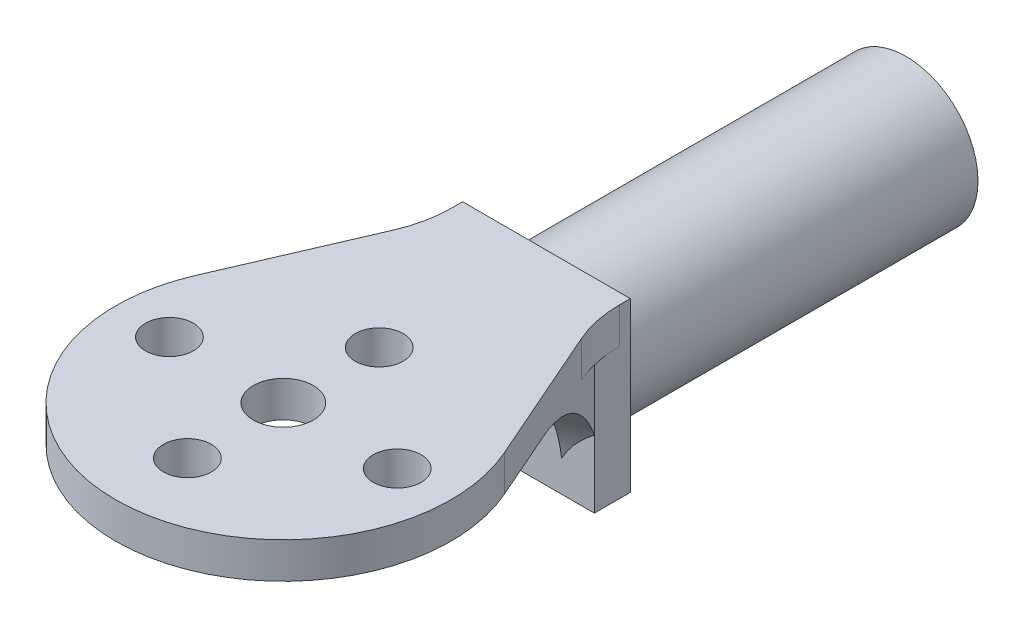
ISO-10303-21;
HEADER;
FILE_DESCRIPTION(('STEP AP214'),'2;1');
FILE_NAME('part.step','',(''),(''),'','','');
FILE_SCHEMA(('AUTOMOTIVE_DESIGN { 1 0 10303 214 1 1 1 1 }'));
ENDSEC;
DATA;
#1=APPLICATION_CONTEXT('core data for automotive mechanical design processes');
#2=APPLICATION_PROTOCOL_DEFINITION('international standard','automotive_design',2000,#1);
#3=PRODUCT_CONTEXT('',#1,'mechanical');
#4=PRODUCT('Part','Part','',(#3));
#5=PRODUCT_RELATED_PRODUCT_CATEGORY('part','',(#4));
#6=PRODUCT_DEFINITION_FORMATION('','',#4);
#7=PRODUCT_DEFINITION_CONTEXT('part definition',#1,'design');
#8=PRODUCT_DEFINITION('design','',#6,#7);
#9=PRODUCT_DEFINITION_SHAPE('','',#8);
#10=(LENGTH_UNIT() NAMED_UNIT(*) SI_UNIT(.MILLI.,.METRE.));
#11=(NAMED_UNIT(*) PLANE_ANGLE_UNIT() SI_UNIT($,.RADIAN.));
#12=(NAMED_UNIT(*) SI_UNIT($,.STERADIAN.) SOLID_ANGLE_UNIT());
#13=UNCERTAINTY_MEASURE_WITH_UNIT(LENGTH_MEASURE(1.E-05),#10,'distance_accuracy_value','');
#14=(GEOMETRIC_REPRESENTATION_CONTEXT(3) GLOBAL_UNCERTAINTY_ASSIGNED_CONTEXT((#13)) GLOBAL_UNIT_ASSIGNED_CONTEXT((#10,
#11,#12)) REPRESENTATION_CONTEXT('',''));
#15=CARTESIAN_POINT('',(0.,0.,0.));
#16=DIRECTION('',(0.,0.,1.));
#17=DIRECTION('',(1.,0.,0.));
#18=AXIS2_PLACEMENT_3D('',#15,#16,#17);
#19=CARTESIAN_POINT('',(0.,4.,0.));
#20=DIRECTION('',(0.,1.,0.));
#21=DIRECTION('',(0.,0.,1.));
#22=AXIS2_PLACEMENT_3D('',#19,#20,#21);
#23=PLANE('',#22);
#24=CARTESIAN_POINT('',(9.55185827927666,4.,51.9999292293122));
#25=DIRECTION('',(0.,1.,0.));
#26=DIRECTION('',(0.,0.,1.));
#27=AXIS2_PLACEMENT_3D('',#24,#25,#26);
#28=CIRCLE('',#27,2.);
#29=CARTESIAN_POINT('',(9.55185827927666,4.,53.9999292293122));
#30=VERTEX_POINT('',#29);
#31=EDGE_CURVE('E303',#30,#30,#28,.T.);
#32=ORIENTED_EDGE('',*,*,#31,.T.);
#33=EDGE_LOOP('',(#32));
#34=FACE_BOUND('',#33,.T.);
#35=CARTESIAN_POINT('',(0.0518582792766051,4.,59.9999292293122));
#36=DIRECTION('',(0.,1.,0.));
#37=DIRECTION('',(0.,0.,1.));
#38=AXIS2_PLACEMENT_3D('',#35,#36,#37);
#39=CIRCLE('',#38,2.);
#40=CARTESIAN_POINT('',(0.0518582792766051,4.,61.9999292293122));
#41=VERTEX_POINT('',#40);
#42=EDGE_CURVE('E300',#41,#41,#39,.T.);
#43=ORIENTED_EDGE('',*,*,#42,.T.);
#44=EDGE_LOOP('',(#43));
#45=FACE_BOUND('',#44,.T.);
#46=CARTESIAN_POINT('',(-9.44814172072447,4.,51.9999292293122));
#47=DIRECTION('',(0.,1.,0.));
#48=DIRECTION('',(0.,0.,1.));
#49=AXIS2_PLACEMENT_3D('',#46,#47,#48);
#50=CIRCLE('',#49,2.);
#51=CARTESIAN_POINT('',(-9.44814172072447,4.,53.9999292293122));
#52=VERTEX_POINT('',#51);
#53=EDGE_CURVE('E297',#52,#52,#50,.T.);
#54=ORIENTED_EDGE('',*,*,#53,.T.);
#55=EDGE_LOOP('',(#54));
#56=FACE_BOUND('',#55,.T.);
#57=CARTESIAN_POINT('',(0.051858279275528,4.,43.9999292293122));
#58=DIRECTION('',(0.,1.,0.));
#59=DIRECTION('',(0.,0.,1.));
#60=AXIS2_PLACEMENT_3D('',#57,#58,#59);
#61=CIRCLE('',#60,2.);
#62=CARTESIAN_POINT('',(0.051858279275528,4.,45.9999292293122));
#63=VERTEX_POINT('',#62);
#64=EDGE_CURVE('E294',#63,#63,#61,.T.);
#65=ORIENTED_EDGE('',*,*,#64,.T.);
#66=EDGE_LOOP('',(#65));
#67=FACE_BOUND('',#66,.T.);
#68=CARTESIAN_POINT('',(0.051858279275528,4.,51.9999292293122));
#69=DIRECTION('',(0.,1.,0.));
#70=DIRECTION('',(0.,0.,1.));
#71=AXIS2_PLACEMENT_3D('',#68,#69,#70);
#72=CIRCLE('',#71,2.5);
#73=CARTESIAN_POINT('',(0.051858279275528,4.,54.4999292293122));
#74=VERTEX_POINT('',#73);
#75=EDGE_CURVE('E252',#74,#74,#72,.T.);
#76=ORIENTED_EDGE('',*,*,#75,.T.);
#77=EDGE_LOOP('',(#76));
#78=FACE_BOUND('',#77,.T.);
#79=DIRECTION('',(0.402002149140903,0.,0.915638723561916));
#80=VECTOR('',#79,1.);
#81=CARTESIAN_POINT('',(4.15877008903242,4.,32.7474139647231));
#82=LINE('',#81,#80);
#83=CARTESIAN_POINT('',(4.26966549615247,4.,33.));
#84=VERTEX_POINT('',#83);
#85=CARTESIAN_POINT('',(8.0681097778568,4.,41.6517016912807));
#86=VERTEX_POINT('',#85);
#87=EDGE_CURVE('E54',#84,#86,#82,.T.);
#88=ORIENTED_EDGE('',*,*,#87,.T.);
#89=DIRECTION('',(0.915638723561916,0.,-0.402002149140903));
#90=VECTOR('',#89,1.);
#91=CARTESIAN_POINT('',(8.0681097778568,4.,41.6517016912807));
#92=LINE('',#91,#90);
#93=CARTESIAN_POINT('',(10.3572065867616,4.,40.6466963184284));
#94=VERTEX_POINT('',#93);
#95=EDGE_CURVE('E161',#86,#94,#92,.T.);
#96=ORIENTED_EDGE('',*,*,#95,.T.);
#97=DIRECTION('',(0.402002149140903,0.,0.915638723561916));
#98=VECTOR('',#97,1.);
#99=CARTESIAN_POINT('',(-6.27816834077861,4.,2.7563678781992));
#100=LINE('',#99,#98);
#101=CARTESIAN_POINT('',(12.8708004091423,4.,46.3718991413395));
#102=VERTEX_POINT('',#101);
#103=EDGE_CURVE('E149',#94,#102,#100,.T.);
#104=ORIENTED_EDGE('',*,*,#103,.T.);
#105=CARTESIAN_POINT('',(0.051858279275528,4.,51.9999292293122));
#106=DIRECTION('',(0.,1.,0.));
#107=DIRECTION('',(0.,0.,1.));
#108=AXIS2_PLACEMENT_3D('',#105,#106,#107);
#109=CIRCLE('',#108,14.);
#110=CARTESIAN_POINT('',(-12.8034008359654,4.,46.4553541256622));
#111=VERTEX_POINT('',#110);
#112=EDGE_CURVE('E159',#111,#102,#109,.T.);
#113=ORIENTED_EDGE('',*,*,#112,.F.);
#114=DIRECTION('',(-0.396041078832143,0.,0.91823279394578));
#115=VECTOR('',#114,1.);
#116=CARTESIAN_POINT('',(6.09865066185789,4.,2.63039634771003));
#117=LINE('',#116,#115);
#118=CARTESIAN_POINT('',(-10.3105364482538,4.,40.6755753249218));
#119=VERTEX_POINT('',#118);
#120=EDGE_CURVE('E316',#119,#111,#117,.T.);
#121=ORIENTED_EDGE('',*,*,#120,.F.);
#122=DIRECTION('',(-0.91823279394578,0.,-0.396041078832143));
#123=VECTOR('',#122,1.);
#124=CARTESIAN_POINT('',(-8.01495446338935,4.,41.6656780220022));
#125=LINE('',#124,#123);
#126=CARTESIAN_POINT('',(-8.01495446338935,4.,41.6656780220022));
#127=VERTEX_POINT('',#126);
#128=EDGE_CURVE('E343',#127,#119,#125,.T.);
#129=ORIENTED_EDGE('',*,*,#128,.F.);
#130=DIRECTION('',(0.396041078832143,0.,-0.91823279394578));
#131=VECTOR('',#130,1.);
#132=CARTESIAN_POINT('',(-4.15893115563554,4.,32.7253755012641));
#133=LINE('',#132,#131);
#134=CARTESIAN_POINT('',(-4.27737887768401,4.,33.));
#135=VERTEX_POINT('',#134);
#136=EDGE_CURVE('E340',#127,#135,#133,.T.);
#137=ORIENTED_EDGE('',*,*,#136,.T.);
#138=DIRECTION('',(1.,0.,0.));
#139=VECTOR('',#138,1.);
#140=CARTESIAN_POINT('',(0.,4.,33.));
#141=LINE('',#140,#139);
#142=EDGE_CURVE('E308',#135,#84,#141,.T.);
#143=ORIENTED_EDGE('',*,*,#142,.T.);
#144=EDGE_LOOP('',(#88,#96,#104,#113,#121,#129,#137,#143));
#145=FACE_BOUND('',#144,.T.);
#146=ADVANCED_FACE('F39',(#34,#45,#56,#67,#78,#145),#23,.F.);
#147=CARTESIAN_POINT('',(17.,4.,30.9014720041082));
#148=DIRECTION('',(0.,1.,0.));
#149=DIRECTION('',(0.,0.,1.));
#150=AXIS2_PLACEMENT_3D('',#147,#148,#149);
#151=CIRCLE('',#150,10.);
#152=CARTESIAN_POINT('',(7.84361276438084,4.,34.9214934955173));
#153=VERTEX_POINT('',#152);
#154=CARTESIAN_POINT('',(7.,4.,30.9014720041082));
#155=VERTEX_POINT('',#154);
#156=EDGE_CURVE('E158',#153,#155,#151,.F.);
#157=ORIENTED_EDGE('',*,*,#156,.F.);
#158=DIRECTION('',(0.402002149140903,0.,0.915638723561916));
#159=VECTOR('',#158,1.);
#160=CARTESIAN_POINT('',(6.44786689793721,4.,31.7424085918709));
#161=LINE('',#160,#159);
#162=CARTESIAN_POINT('',(7.,4.,33.));
#163=VERTEX_POINT('',#162);
#164=EDGE_CURVE('E167',#163,#153,#161,.T.);
#165=ORIENTED_EDGE('',*,*,#164,.F.);
#166=DIRECTION('',(0.,0.,-1.));
#167=VECTOR('',#166,1.);
#168=CARTESIAN_POINT('',(7.,4.,0.));
#169=LINE('',#168,#167);
#170=EDGE_CURVE('E310',#163,#155,#169,.T.);
#171=ORIENTED_EDGE('',*,*,#170,.T.);
#172=EDGE_LOOP('',(#157,#165,#171));
#173=FACE_BOUND('',#172,.T.);
#174=ADVANCED_FACE('F334',(#173),#23,.F.);
#175=DIRECTION('',(0.396041078832143,0.,-0.91823279394578));
#176=VECTOR('',#175,1.);
#177=CARTESIAN_POINT('',(6.09865066185789,4.,2.63039634771004));
#178=LINE('',#177,#176);
#179=CARTESIAN_POINT('',(-7.81767206054221,4.,34.8957965241815));
#180=VERTEX_POINT('',#179);
#181=CARTESIAN_POINT('',(-7.,4.,33.));
#182=VERTEX_POINT('',#181);
#183=EDGE_CURVE('E11',#180,#182,#178,.T.);
#184=ORIENTED_EDGE('',*,*,#183,.F.);
#185=CARTESIAN_POINT('',(-17.,4.,30.9353857358601));
#186=DIRECTION('',(0.,1.,0.));
#187=DIRECTION('',(0.,0.,1.));
#188=AXIS2_PLACEMENT_3D('',#185,#186,#187);
#189=CIRCLE('',#188,10.);
#190=CARTESIAN_POINT('',(-7.,4.,30.9353857358601));
#191=VERTEX_POINT('',#190);
#192=EDGE_CURVE('E264',#180,#191,#189,.T.);
#193=ORIENTED_EDGE('',*,*,#192,.T.);
#194=DIRECTION('',(0.,0.,1.));
#195=VECTOR('',#194,1.);
#196=CARTESIAN_POINT('',(-7.,4.,0.));
#197=LINE('',#196,#195);
#198=EDGE_CURVE('E306',#191,#182,#197,.T.);
#199=ORIENTED_EDGE('',*,*,#198,.T.);
#200=EDGE_LOOP('',(#184,#193,#199));
#201=FACE_BOUND('',#200,.T.);
#202=ADVANCED_FACE('F392',(#201),#23,.F.);
#203=CARTESIAN_POINT('',(0.,0.,33.));
#204=DIRECTION('',(0.,0.,1.));
#205=DIRECTION('',(1.,0.,0.));
#206=AXIS2_PLACEMENT_3D('',#203,#204,#205);
#207=PLANE('',#206);
#208=CARTESIAN_POINT('',(0.,0.,33.));
#209=DIRECTION('',(0.,0.,1.));
#210=DIRECTION('',(1.,0.,0.));
#211=AXIS2_PLACEMENT_3D('',#208,#209,#210);
#212=CIRCLE('',#211,2.5);
#213=CARTESIAN_POINT('',(2.5,0.,33.));
#214=VERTEX_POINT('',#213);
#215=EDGE_CURVE('E168',#214,#214,#212,.T.);
#216=ORIENTED_EDGE('',*,*,#215,.F.);
#217=EDGE_LOOP('',(#216));
#218=FACE_BOUND('',#217,.T.);
#219=CARTESIAN_POINT('',(4.26966549615247,-4.39857791230481,33.));
#220=CARTESIAN_POINT('',(4.35557810708206,-4.23809018643889,33.));
#221=CARTESIAN_POINT('',(4.44796712719578,-4.08119908312746,33.));
#222=CARTESIAN_POINT('',(4.64374575712088,-3.77511158173039,33.));
#223=CARTESIAN_POINT('',(4.74709990752518,-3.62589256530896,33.));
#224=CARTESIAN_POINT('',(4.96334532686161,-3.33473886176205,33.));
#225=CARTESIAN_POINT('',(5.0762302377719,-3.19279941842389,33.));
#226=CARTESIAN_POINT('',(5.30852706258606,-2.91791083639027,33.));
#227=CARTESIAN_POINT('',(5.42782027662737,-2.78486101999803,33.));
#228=CARTESIAN_POINT('',(5.67334191683889,-2.5251968358304,33.));
#229=CARTESIAN_POINT('',(5.79957443956189,-2.39858635622287,33.));
#230=CARTESIAN_POINT('',(6.05793455654453,-2.15159589990567,33.));
#231=CARTESIAN_POINT('',(6.19006104302503,-2.03121476149288,33.));
#232=CARTESIAN_POINT('',(6.43392525099127,-1.81856756395461,33.));
#233=CARTESIAN_POINT('',(6.54478806669445,-1.72529300727227,33.));
#234=CARTESIAN_POINT('',(6.76997960807686,-1.54206031754586,33.));
#235=CARTESIAN_POINT('',(6.88432066799888,-1.45211733002247,33.));
#236=CARTESIAN_POINT('',(6.99999999999999,-1.36394541030519,33.));
#237=B_SPLINE_CURVE_WITH_KNOTS('',3,(#219,#220,#221,#222,#223,#224,#225,#226,#227,#228,#229,
#230,#231,#232,#233,#234,#235,#236),.UNSPECIFIED.,.F.,.F.,(4,2,2,2,2,2,2,2,4),(0.,
0.545793393495718,1.08987268295838,1.63359183945271,2.16940908543465,2.70554611557918,
3.2415827990898,3.67615110769117,4.11249904194571),.UNSPECIFIED.);
#238=CARTESIAN_POINT('',(4.26966549615247,-4.39857791230481,33.));
#239=VERTEX_POINT('',#238);
#240=CARTESIAN_POINT('',(7.,-1.36394541030517,33.));
#241=VERTEX_POINT('',#240);
#242=EDGE_CURVE('E62',#239,#241,#237,.T.);
#243=ORIENTED_EDGE('',*,*,#242,.F.);
#244=DIRECTION('',(0.,1.,0.));
#245=VECTOR('',#244,1.);
#246=CARTESIAN_POINT('',(4.26966549615247,0.,33.));
#247=LINE('',#246,#245);
#248=EDGE_CURVE('E186',#239,#84,#247,.T.);
#249=ORIENTED_EDGE('',*,*,#248,.T.);
#250=ORIENTED_EDGE('',*,*,#142,.F.);
#251=DIRECTION('',(0.,1.,0.));
#252=VECTOR('',#251,1.);
#253=CARTESIAN_POINT('',(-4.27737887768402,0.,33.));
#254=LINE('',#253,#252);
#255=CARTESIAN_POINT('',(-4.27737887768402,-4.29454560285519,33.));
#256=VERTEX_POINT('',#255);
#257=EDGE_CURVE('E326',#256,#135,#254,.T.);
#258=ORIENTED_EDGE('',*,*,#257,.F.);
#259=CARTESIAN_POINT('',(-7.0000000000001,-1.3597215527771,33.0000000000002));
#260=CARTESIAN_POINT('',(-6.85226719892343,-1.47041960169081,33.0000000000001));
#261=CARTESIAN_POINT('',(-6.70660973909124,-1.58394492958086,33.));
#262=CARTESIAN_POINT('',(-6.41966411909858,-1.81746173609029,33.));
#263=CARTESIAN_POINT('',(-6.27839455296337,-1.93747603144562,33.));
#264=CARTESIAN_POINT('',(-6.00138746788396,-2.18411529013319,33.));
#265=CARTESIAN_POINT('',(-5.86565755912559,-2.31074883620528,33.));
#266=CARTESIAN_POINT('',(-5.6035474056518,-2.56825728241939,33.));
#267=CARTESIAN_POINT('',(-5.47703444348814,-2.6989966637613,33.));
#268=CARTESIAN_POINT('',(-5.23167618190011,-2.96721544555661,33.));
#269=CARTESIAN_POINT('',(-5.11282179763055,-3.10468650664694,33.));
#270=CARTESIAN_POINT('',(-4.88401135045867,-3.38664640135503,33.));
#271=CARTESIAN_POINT('',(-4.77404591202944,-3.53112757668643,33.0000000000001));
#272=CARTESIAN_POINT('',(-4.59911148070718,-3.77830834628809,33.0000000000001));
#273=CARTESIAN_POINT('',(-4.53130060112186,-3.87900036717615,33.));
#274=CARTESIAN_POINT('',(-4.40049466690124,-4.08408709213776,33.));
#275=CARTESIAN_POINT('',(-4.33752218623202,-4.18849617581251,32.9999999999999));
#276=CARTESIAN_POINT('',(-4.27737887768402,-4.29454560285519,33.));
#277=B_SPLINE_CURVE_WITH_KNOTS('',3,(#259,#260,#261,#262,#263,#264,#265,#266,#267,#268,#269,
#270,#271,#272,#273,#274,#275,#276),.UNSPECIFIED.,.F.,.F.,(4,2,2,2,2,2,2,2,4),(0.,
0.553833381326058,1.10975993497846,1.66642612231681,2.21195669516203,2.75682775396257,
3.30111640589065,3.66516698386851,4.03082419389452),.UNSPECIFIED.);
#278=CARTESIAN_POINT('',(-7.,-1.3597215527781,33.));
#279=VERTEX_POINT('',#278);
#280=EDGE_CURVE('E291',#279,#256,#277,.T.);
#281=ORIENTED_EDGE('',*,*,#280,.F.);
#282=DIRECTION('',(0.,-1.,0.));
#283=VECTOR('',#282,1.);
#284=CARTESIAN_POINT('',(-7.,7.,33.));
#285=LINE('',#284,#283);
#286=CARTESIAN_POINT('',(-7.,-7.,33.));
#287=VERTEX_POINT('',#286);
#288=EDGE_CURVE('E232',#279,#287,#285,.T.);
#289=ORIENTED_EDGE('',*,*,#288,.T.);
#290=DIRECTION('',(1.,0.,0.));
#291=VECTOR('',#290,1.);
#292=CARTESIAN_POINT('',(-7.,-7.,33.));
#293=LINE('',#292,#291);
#294=CARTESIAN_POINT('',(7.,-7.,33.));
#295=VERTEX_POINT('',#294);
#296=EDGE_CURVE('E244',#287,#295,#293,.T.);
#297=ORIENTED_EDGE('',*,*,#296,.T.);
#298=DIRECTION('',(0.,1.,0.));
#299=VECTOR('',#298,1.);
#300=CARTESIAN_POINT('',(7.,7.,33.));
#301=LINE('',#300,#299);
#302=EDGE_CURVE('E228',#295,#241,#301,.T.);
#303=ORIENTED_EDGE('',*,*,#302,.T.);
#304=EDGE_LOOP('',(#243,#249,#250,#258,#281,#289,#297,#303));
#305=FACE_BOUND('',#304,.T.);
#306=ADVANCED_FACE('F188',(#218,#305),#207,.T.);
#307=CARTESIAN_POINT('',(0.,0.,30.));
#308=DIRECTION('',(0.,0.,-1.));
#309=DIRECTION('',(-1.,0.,0.));
#310=AXIS2_PLACEMENT_3D('',#307,#308,#309);
#311=CYLINDRICAL_SURFACE('',#310,6.);
#312=CARTESIAN_POINT('',(0.,0.,30.));
#313=DIRECTION('',(0.,0.,1.));
#314=DIRECTION('',(1.,0.,0.));
#315=AXIS2_PLACEMENT_3D('',#312,#313,#314);
#316=CIRCLE('',#315,6.);
#317=CARTESIAN_POINT('',(6.,0.,30.));
#318=VERTEX_POINT('',#317);
#319=EDGE_CURVE('E47',#318,#318,#316,.T.);
#320=ORIENTED_EDGE('',*,*,#319,.F.);
#321=EDGE_LOOP('',(#320));
#322=FACE_BOUND('',#321,.T.);
#323=CARTESIAN_POINT('',(0.,0.,0.));
#324=DIRECTION('',(0.,0.,1.));
#325=DIRECTION('',(1.,0.,0.));
#326=AXIS2_PLACEMENT_3D('',#323,#324,#325);
#327=CIRCLE('',#326,6.);
#328=CARTESIAN_POINT('',(6.,0.,0.));
#329=VERTEX_POINT('',#328);
#330=EDGE_CURVE('E213',#329,#329,#327,.T.);
#331=ORIENTED_EDGE('',*,*,#330,.T.);
#332=EDGE_LOOP('',(#331));
#333=FACE_BOUND('',#332,.T.);
#334=ADVANCED_FACE('F41',(#322,#333),#311,.T.);
#335=CARTESIAN_POINT('',(0.,0.,0.));
#336=DIRECTION('',(0.,0.,1.));
#337=DIRECTION('',(1.,0.,0.));
#338=AXIS2_PLACEMENT_3D('',#335,#336,#337);
#339=PLANE('',#338);
#340=CARTESIAN_POINT('',(0.,0.,0.));
#341=DIRECTION('',(0.,0.,-1.));
#342=DIRECTION('',(-1.,0.,0.));
#343=AXIS2_PLACEMENT_3D('',#340,#341,#342);
#344=CIRCLE('',#343,2.5);
#345=CARTESIAN_POINT('',(-2.5,0.,0.));
#346=VERTEX_POINT('',#345);
#347=EDGE_CURVE('E174',#346,#346,#344,.T.);
#348=ORIENTED_EDGE('',*,*,#347,.F.);
#349=EDGE_LOOP('',(#348));
#350=FACE_BOUND('',#349,.T.);
#351=ORIENTED_EDGE('',*,*,#330,.F.);
#352=EDGE_LOOP('',(#351));
#353=FACE_BOUND('',#352,.T.);
#354=ADVANCED_FACE('F207',(#350,#353),#339,.F.);
#355=CARTESIAN_POINT('',(-7.,7.,33.));
#356=DIRECTION('',(1.,0.,0.));
#357=DIRECTION('',(0.,0.,-1.));
#358=AXIS2_PLACEMENT_3D('',#355,#356,#357);
#359=PLANE('',#358);
#360=ORIENTED_EDGE('',*,*,#198,.F.);
#361=DIRECTION('',(0.,1.,0.));
#362=VECTOR('',#361,1.);
#363=CARTESIAN_POINT('',(-7.,4.,30.9353857358601));
#364=LINE('',#363,#362);
#365=CARTESIAN_POINT('',(-7.,7.,30.9353857358601));
#366=VERTEX_POINT('',#365);
#367=EDGE_CURVE('E241',#191,#366,#364,.T.);
#368=ORIENTED_EDGE('',*,*,#367,.T.);
#369=DIRECTION('',(0.,0.,-1.));
#370=VECTOR('',#369,1.);
#371=CARTESIAN_POINT('',(-7.,7.,33.));
#372=LINE('',#371,#370);
#373=CARTESIAN_POINT('',(-7.,7.,30.));
#374=VERTEX_POINT('',#373);
#375=EDGE_CURVE('E226',#366,#374,#372,.T.);
#376=ORIENTED_EDGE('',*,*,#375,.T.);
#377=DIRECTION('',(0.,-1.,0.));
#378=VECTOR('',#377,1.);
#379=CARTESIAN_POINT('',(-7.,7.,30.));
#380=LINE('',#379,#378);
#381=CARTESIAN_POINT('',(-7.,-7.,30.));
#382=VERTEX_POINT('',#381);
#383=EDGE_CURVE('E238',#374,#382,#380,.T.);
#384=ORIENTED_EDGE('',*,*,#383,.T.);
#385=DIRECTION('',(0.,0.,-1.));
#386=VECTOR('',#385,1.);
#387=CARTESIAN_POINT('',(-7.,-7.,33.));
#388=LINE('',#387,#386);
#389=EDGE_CURVE('E215',#287,#382,#388,.T.);
#390=ORIENTED_EDGE('',*,*,#389,.F.);
#391=ORIENTED_EDGE('',*,*,#288,.F.);
#392=EDGE_CURVE('E246',#182,#279,#285,.T.);
#393=ORIENTED_EDGE('',*,*,#392,.F.);
#394=EDGE_LOOP('',(#360,#368,#376,#384,#390,#391,#393));
#395=FACE_BOUND('',#394,.T.);
#396=ADVANCED_FACE('F210',(#395),#359,.F.);
#397=CARTESIAN_POINT('',(-7.,-7.,33.));
#398=DIRECTION('',(0.,1.,0.));
#399=DIRECTION('',(0.,0.,1.));
#400=AXIS2_PLACEMENT_3D('',#397,#398,#399);
#401=PLANE('',#400);
#402=DIRECTION('',(1.,0.,0.));
#403=VECTOR('',#402,1.);
#404=CARTESIAN_POINT('',(-7.,-7.,30.));
#405=LINE('',#404,#403);
#406=CARTESIAN_POINT('',(7.,-7.,30.));
#407=VERTEX_POINT('',#406);
#408=EDGE_CURVE('E236',#382,#407,#405,.T.);
#409=ORIENTED_EDGE('',*,*,#408,.T.);
#410=DIRECTION('',(0.,0.,-1.));
#411=VECTOR('',#410,1.);
#412=CARTESIAN_POINT('',(7.,-7.,33.));
#413=LINE('',#412,#411);
#414=EDGE_CURVE('E219',#295,#407,#413,.T.);
#415=ORIENTED_EDGE('',*,*,#414,.F.);
#416=ORIENTED_EDGE('',*,*,#296,.F.);
#417=ORIENTED_EDGE('',*,*,#389,.T.);
#418=EDGE_LOOP('',(#409,#415,#416,#417));
#419=FACE_BOUND('',#418,.T.);
#420=ADVANCED_FACE('F364',(#419),#401,.F.);
#421=CARTESIAN_POINT('',(7.,7.,33.));
#422=DIRECTION('',(-1.,0.,0.));
#423=DIRECTION('',(0.,-1.,0.));
#424=AXIS2_PLACEMENT_3D('',#421,#422,#423);
#425=PLANE('',#424);
#426=DIRECTION('',(0.,0.,-1.));
#427=VECTOR('',#426,1.);
#428=CARTESIAN_POINT('',(7.,7.,33.));
#429=LINE('',#428,#427);
#430=CARTESIAN_POINT('',(7.,7.,30.9014720041082));
#431=VERTEX_POINT('',#430);
#432=CARTESIAN_POINT('',(7.,7.,30.));
#433=VERTEX_POINT('',#432);
#434=EDGE_CURVE('E224',#431,#433,#429,.T.);
#435=ORIENTED_EDGE('',*,*,#434,.F.);
#436=DIRECTION('',(0.,1.,0.));
#437=VECTOR('',#436,1.);
#438=CARTESIAN_POINT('',(7.,4.,30.9014720041082));
#439=LINE('',#438,#437);
#440=EDGE_CURVE('E257',#155,#431,#439,.T.);
#441=ORIENTED_EDGE('',*,*,#440,.F.);
#442=ORIENTED_EDGE('',*,*,#170,.F.);
#443=EDGE_CURVE('E243',#241,#163,#301,.T.);
#444=ORIENTED_EDGE('',*,*,#443,.F.);
#445=ORIENTED_EDGE('',*,*,#302,.F.);
#446=ORIENTED_EDGE('',*,*,#414,.T.);
#447=DIRECTION('',(0.,1.,0.));
#448=VECTOR('',#447,1.);
#449=CARTESIAN_POINT('',(7.,7.,30.));
#450=LINE('',#449,#448);
#451=EDGE_CURVE('E233',#407,#433,#450,.T.);
#452=ORIENTED_EDGE('',*,*,#451,.T.);
#453=EDGE_LOOP('',(#435,#441,#442,#444,#445,#446,#452));
#454=FACE_BOUND('',#453,.T.);
#455=ADVANCED_FACE('F368',(#454),#425,.F.);
#456=CARTESIAN_POINT('',(-7.,7.,33.));
#457=DIRECTION('',(0.,-1.,0.));
#458=DIRECTION('',(0.,0.,-1.));
#459=AXIS2_PLACEMENT_3D('',#456,#457,#458);
#460=PLANE('',#459);
#461=ORIENTED_EDGE('',*,*,#375,.F.);
#462=CARTESIAN_POINT('',(-17.,7.,30.9353857358601));
#463=DIRECTION('',(0.,1.,0.));
#464=DIRECTION('',(0.,0.,1.));
#465=AXIS2_PLACEMENT_3D('',#462,#463,#464);
#466=CIRCLE('',#465,10.);
#467=CARTESIAN_POINT('',(-7.81767206054221,7.,34.8957965241815));
#468=VERTEX_POINT('',#467);
#469=EDGE_CURVE('E288',#468,#366,#466,.T.);
#470=ORIENTED_EDGE('',*,*,#469,.F.);
#471=DIRECTION('',(-0.396041078832143,0.,0.91823279394578));
#472=VECTOR('',#471,1.);
#473=CARTESIAN_POINT('',(6.09865066185789,7.,2.63039634771003));
#474=LINE('',#473,#472);
#475=CARTESIAN_POINT('',(-12.8034008359654,7.,46.4553541256622));
#476=VERTEX_POINT('',#475);
#477=EDGE_CURVE('E285',#468,#476,#474,.T.);
#478=ORIENTED_EDGE('',*,*,#477,.T.);
#479=CARTESIAN_POINT('',(0.051858279275528,7.,51.9999292293122));
#480=DIRECTION('',(0.,1.,0.));
#481=DIRECTION('',(0.,0.,1.));
#482=AXIS2_PLACEMENT_3D('',#479,#480,#481);
#483=CIRCLE('',#482,14.);
#484=CARTESIAN_POINT('',(12.8708004091423,7.,46.3718991413395));
#485=VERTEX_POINT('',#484);
#486=EDGE_CURVE('E282',#476,#485,#483,.T.);
#487=ORIENTED_EDGE('',*,*,#486,.T.);
#488=DIRECTION('',(0.402002149140903,0.,0.915638723561916));
#489=VECTOR('',#488,1.);
#490=CARTESIAN_POINT('',(-6.27816834077861,7.,2.7563678781992));
#491=LINE('',#490,#489);
#492=CARTESIAN_POINT('',(7.84361276438084,7.,34.9214934955173));
#493=VERTEX_POINT('',#492);
#494=EDGE_CURVE('E280',#493,#485,#491,.T.);
#495=ORIENTED_EDGE('',*,*,#494,.F.);
#496=CARTESIAN_POINT('',(17.,7.,30.9014720041082));
#497=DIRECTION('',(0.,1.,0.));
#498=DIRECTION('',(0.,0.,1.));
#499=AXIS2_PLACEMENT_3D('',#496,#497,#498);
#500=CIRCLE('',#499,10.);
#501=EDGE_CURVE('E277',#493,#431,#500,.F.);
#502=ORIENTED_EDGE('',*,*,#501,.T.);
#503=ORIENTED_EDGE('',*,*,#434,.T.);
#504=DIRECTION('',(-1.,0.,0.));
#505=VECTOR('',#504,1.);
#506=CARTESIAN_POINT('',(-7.,7.,30.));
#507=LINE('',#506,#505);
#508=EDGE_CURVE('E229',#433,#374,#507,.T.);
#509=ORIENTED_EDGE('',*,*,#508,.T.);
#510=EDGE_LOOP('',(#461,#470,#478,#487,#495,#502,#503,#509));
#511=FACE_BOUND('',#510,.T.);
#512=CARTESIAN_POINT('',(9.55185827927666,7.,51.9999292293122));
#513=DIRECTION('',(0.,1.,0.));
#514=DIRECTION('',(0.,0.,1.));
#515=AXIS2_PLACEMENT_3D('',#512,#513,#514);
#516=CIRCLE('',#515,2.);
#517=CARTESIAN_POINT('',(9.55185827927666,7.,53.9999292293122));
#518=VERTEX_POINT('',#517);
#519=EDGE_CURVE('E274',#518,#518,#516,.T.);
#520=ORIENTED_EDGE('',*,*,#519,.F.);
#521=EDGE_LOOP('',(#520));
#522=FACE_BOUND('',#521,.T.);
#523=CARTESIAN_POINT('',(0.0518582792766051,7.,59.9999292293122));
#524=DIRECTION('',(0.,1.,0.));
#525=DIRECTION('',(0.,0.,1.));
#526=AXIS2_PLACEMENT_3D('',#523,#524,#525);
#527=CIRCLE('',#526,2.);
#528=CARTESIAN_POINT('',(0.0518582792766051,7.,61.9999292293122));
#529=VERTEX_POINT('',#528);
#530=EDGE_CURVE('E271',#529,#529,#527,.T.);
#531=ORIENTED_EDGE('',*,*,#530,.F.);
#532=EDGE_LOOP('',(#531));
#533=FACE_BOUND('',#532,.T.);
#534=CARTESIAN_POINT('',(-9.44814172072447,7.,51.9999292293122));
#535=DIRECTION('',(0.,1.,0.));
#536=DIRECTION('',(0.,0.,1.));
#537=AXIS2_PLACEMENT_3D('',#534,#535,#536);
#538=CIRCLE('',#537,2.);
#539=CARTESIAN_POINT('',(-9.44814172072447,7.,53.9999292293122));
#540=VERTEX_POINT('',#539);
#541=EDGE_CURVE('E268',#540,#540,#538,.T.);
#542=ORIENTED_EDGE('',*,*,#541,.F.);
#543=EDGE_LOOP('',(#542));
#544=FACE_BOUND('',#543,.T.);
#545=CARTESIAN_POINT('',(0.051858279275528,7.,43.9999292293122));
#546=DIRECTION('',(0.,1.,0.));
#547=DIRECTION('',(0.,0.,1.));
#548=AXIS2_PLACEMENT_3D('',#545,#546,#547);
#549=CIRCLE('',#548,2.);
#550=CARTESIAN_POINT('',(0.051858279275528,7.,45.9999292293122));
#551=VERTEX_POINT('',#550);
#552=EDGE_CURVE('E265',#551,#551,#549,.T.);
#553=ORIENTED_EDGE('',*,*,#552,.F.);
#554=EDGE_LOOP('',(#553));
#555=FACE_BOUND('',#554,.T.);
#556=CARTESIAN_POINT('',(0.051858279275528,7.,51.9999292293122));
#557=DIRECTION('',(0.,1.,0.));
#558=DIRECTION('',(0.,0.,1.));
#559=AXIS2_PLACEMENT_3D('',#556,#557,#558);
#560=CIRCLE('',#559,2.5);
#561=CARTESIAN_POINT('',(0.051858279275528,7.,54.4999292293122));
#562=VERTEX_POINT('',#561);
#563=EDGE_CURVE('E261',#562,#562,#560,.T.);
#564=ORIENTED_EDGE('',*,*,#563,.F.);
#565=EDGE_LOOP('',(#564));
#566=FACE_BOUND('',#565,.T.);
#567=ADVANCED_FACE('F378',(#511,#522,#533,#544,#555,#566),#460,.F.);
#568=CARTESIAN_POINT('',(0.,0.,30.));
#569=DIRECTION('',(0.,0.,1.));
#570=DIRECTION('',(1.,0.,0.));
#571=AXIS2_PLACEMENT_3D('',#568,#569,#570);
#572=PLANE('',#571);
#573=ORIENTED_EDGE('',*,*,#319,.T.);
#574=EDGE_LOOP('',(#573));
#575=FACE_BOUND('',#574,.T.);
#576=ORIENTED_EDGE('',*,*,#383,.F.);
#577=ORIENTED_EDGE('',*,*,#508,.F.);
#578=ORIENTED_EDGE('',*,*,#451,.F.);
#579=ORIENTED_EDGE('',*,*,#408,.F.);
#580=EDGE_LOOP('',(#576,#577,#578,#579));
#581=FACE_BOUND('',#580,.T.);
#582=ADVANCED_FACE('F410',(#575,#581),#572,.F.);
#583=CARTESIAN_POINT('',(-17.,4.,30.9353857358601));
#584=DIRECTION('',(0.,1.,0.));
#585=DIRECTION('',(0.,0.,1.));
#586=AXIS2_PLACEMENT_3D('',#583,#584,#585);
#587=CYLINDRICAL_SURFACE('',#586,10.);
#588=ORIENTED_EDGE('',*,*,#469,.T.);
#589=ORIENTED_EDGE('',*,*,#367,.F.);
#590=ORIENTED_EDGE('',*,*,#192,.F.);
#591=DIRECTION('',(0.,1.,0.));
#592=VECTOR('',#591,1.);
#593=CARTESIAN_POINT('',(-7.81767206054221,4.,34.8957965241815));
#594=LINE('',#593,#592);
#595=EDGE_CURVE('E249',#180,#468,#594,.T.);
#596=ORIENTED_EDGE('',*,*,#595,.T.);
#597=EDGE_LOOP('',(#588,#589,#590,#596));
#598=FACE_BOUND('',#597,.T.);
#599=ADVANCED_FACE('F406',(#598),#587,.F.);
#600=CARTESIAN_POINT('',(17.,4.,30.9014720041082));
#601=DIRECTION('',(0.,1.,0.));
#602=DIRECTION('',(0.,0.,1.));
#603=AXIS2_PLACEMENT_3D('',#600,#601,#602);
#604=CYLINDRICAL_SURFACE('',#603,10.);
#605=ORIENTED_EDGE('',*,*,#501,.F.);
#606=DIRECTION('',(0.,1.,0.));
#607=VECTOR('',#606,1.);
#608=CARTESIAN_POINT('',(7.84361276438084,4.,34.9214934955173));
#609=LINE('',#608,#607);
#610=EDGE_CURVE('E255',#153,#493,#609,.T.);
#611=ORIENTED_EDGE('',*,*,#610,.F.);
#612=ORIENTED_EDGE('',*,*,#156,.T.);
#613=ORIENTED_EDGE('',*,*,#440,.T.);
#614=EDGE_LOOP('',(#605,#611,#612,#613));
#615=FACE_BOUND('',#614,.T.);
#616=ADVANCED_FACE('F375',(#615),#604,.F.);
#617=CARTESIAN_POINT('',(-6.27816834077861,4.,2.7563678781992));
#618=DIRECTION('',(-0.915638723561916,0.,0.402002149140903));
#619=DIRECTION('',(0.402002149140903,0.,0.915638723561916));
#620=AXIS2_PLACEMENT_3D('',#617,#618,#619);
#621=PLANE('',#620);
#622=ORIENTED_EDGE('',*,*,#494,.T.);
#623=DIRECTION('',(0.,1.,0.));
#624=VECTOR('',#623,1.);
#625=CARTESIAN_POINT('',(12.8708004091423,4.,46.3718991413395));
#626=LINE('',#625,#624);
#627=EDGE_CURVE('E155',#102,#485,#626,.T.);
#628=ORIENTED_EDGE('',*,*,#627,.F.);
#629=ORIENTED_EDGE('',*,*,#103,.F.);
#630=CARTESIAN_POINT('',(10.3572065867616,-7.,40.6466963184284));
#631=DIRECTION('',(-0.915638723561916,0.,0.402002149140903));
#632=DIRECTION('',(0.,-1.,0.));
#633=AXIS2_PLACEMENT_3D('',#630,#631,#632);
#634=ELLIPSE('',#633,11.,9.72467360480242);
#635=EDGE_CURVE('E154',#94,#241,#634,.T.);
#636=ORIENTED_EDGE('',*,*,#635,.T.);
#637=ORIENTED_EDGE('',*,*,#443,.T.);
#638=ORIENTED_EDGE('',*,*,#164,.T.);
#639=ORIENTED_EDGE('',*,*,#610,.T.);
#640=EDGE_LOOP('',(#622,#628,#629,#636,#637,#638,#639));
#641=FACE_BOUND('',#640,.T.);
#642=ADVANCED_FACE('F151',(#641),#621,.F.);
#643=CARTESIAN_POINT('',(0.051858279275528,4.,51.9999292293122));
#644=DIRECTION('',(0.,1.,0.));
#645=DIRECTION('',(0.,0.,1.));
#646=AXIS2_PLACEMENT_3D('',#643,#644,#645);
#647=CYLINDRICAL_SURFACE('',#646,14.);
#648=ORIENTED_EDGE('',*,*,#486,.F.);
#649=DIRECTION('',(0.,1.,0.));
#650=VECTOR('',#649,1.);
#651=CARTESIAN_POINT('',(-12.8034008359654,4.,46.4553541256622));
#652=LINE('',#651,#650);
#653=EDGE_CURVE('E251',#111,#476,#652,.T.);
#654=ORIENTED_EDGE('',*,*,#653,.F.);
#655=ORIENTED_EDGE('',*,*,#112,.T.);
#656=ORIENTED_EDGE('',*,*,#627,.T.);
#657=EDGE_LOOP('',(#648,#654,#655,#656));
#658=FACE_BOUND('',#657,.T.);
#659=ADVANCED_FACE('F383',(#658),#647,.T.);
#660=CARTESIAN_POINT('',(0.051858279275528,4.,43.9999292293122));
#661=DIRECTION('',(0.,1.,0.));
#662=DIRECTION('',(0.,0.,1.));
#663=AXIS2_PLACEMENT_3D('',#660,#661,#662);
#664=CYLINDRICAL_SURFACE('',#663,2.);
#665=ORIENTED_EDGE('',*,*,#64,.F.);
#666=EDGE_LOOP('',(#665));
#667=FACE_BOUND('',#666,.T.);
#668=ORIENTED_EDGE('',*,*,#552,.T.);
#669=EDGE_LOOP('',(#668));
#670=FACE_BOUND('',#669,.T.);
#671=ADVANCED_FACE('F458',(#667,#670),#664,.F.);
#672=CARTESIAN_POINT('',(-9.44814172072447,4.,51.9999292293122));
#673=DIRECTION('',(0.,1.,0.));
#674=DIRECTION('',(0.,0.,1.));
#675=AXIS2_PLACEMENT_3D('',#672,#673,#674);
#676=CYLINDRICAL_SURFACE('',#675,2.);
#677=ORIENTED_EDGE('',*,*,#53,.F.);
#678=EDGE_LOOP('',(#677));
#679=FACE_BOUND('',#678,.T.);
#680=ORIENTED_EDGE('',*,*,#541,.T.);
#681=EDGE_LOOP('',(#680));
#682=FACE_BOUND('',#681,.T.);
#683=ADVANCED_FACE('F469',(#679,#682),#676,.F.);
#684=CARTESIAN_POINT('',(0.0518582792766051,4.,59.9999292293122));
#685=DIRECTION('',(0.,1.,0.));
#686=DIRECTION('',(0.,0.,1.));
#687=AXIS2_PLACEMENT_3D('',#684,#685,#686);
#688=CYLINDRICAL_SURFACE('',#687,2.);
#689=ORIENTED_EDGE('',*,*,#42,.F.);
#690=EDGE_LOOP('',(#689));
#691=FACE_BOUND('',#690,.T.);
#692=ORIENTED_EDGE('',*,*,#530,.T.);
#693=EDGE_LOOP('',(#692));
#694=FACE_BOUND('',#693,.T.);
#695=ADVANCED_FACE('F479',(#691,#694),#688,.F.);
#696=CARTESIAN_POINT('',(9.55185827927666,4.,51.9999292293122));
#697=DIRECTION('',(0.,1.,0.));
#698=DIRECTION('',(0.,0.,1.));
#699=AXIS2_PLACEMENT_3D('',#696,#697,#698);
#700=CYLINDRICAL_SURFACE('',#699,2.);
#701=ORIENTED_EDGE('',*,*,#31,.F.);
#702=EDGE_LOOP('',(#701));
#703=FACE_BOUND('',#702,.T.);
#704=ORIENTED_EDGE('',*,*,#519,.T.);
#705=EDGE_LOOP('',(#704));
#706=FACE_BOUND('',#705,.T.);
#707=ADVANCED_FACE('F489',(#703,#706),#700,.F.);
#708=CARTESIAN_POINT('',(6.09865066185789,4.,2.63039634771003));
#709=DIRECTION('',(-0.918232793945779,0.,-0.396041078832143));
#710=DIRECTION('',(-0.396041078832143,0.,0.91823279394578));
#711=AXIS2_PLACEMENT_3D('',#708,#709,#710);
#712=PLANE('',#711);
#713=ORIENTED_EDGE('',*,*,#477,.F.);
#714=ORIENTED_EDGE('',*,*,#595,.F.);
#715=ORIENTED_EDGE('',*,*,#183,.T.);
#716=ORIENTED_EDGE('',*,*,#392,.T.);
#717=CARTESIAN_POINT('',(-10.3105364482538,-7.,40.6755753249218));
#718=DIRECTION('',(0.91823279394578,0.,0.396041078832143));
#719=DIRECTION('',(0.,-1.,0.));
#720=AXIS2_PLACEMENT_3D('',#717,#718,#719);
#721=ELLIPSE('',#720,11.,9.73642259314249);
#722=EDGE_CURVE('E341',#279,#119,#721,.T.);
#723=ORIENTED_EDGE('',*,*,#722,.T.);
#724=ORIENTED_EDGE('',*,*,#120,.T.);
#725=ORIENTED_EDGE('',*,*,#653,.T.);
#726=EDGE_LOOP('',(#713,#714,#715,#716,#723,#724,#725));
#727=FACE_BOUND('',#726,.T.);
#728=ADVANCED_FACE('F355',(#727),#712,.T.);
#729=CARTESIAN_POINT('',(0.051858279275528,4.,51.9999292293122));
#730=DIRECTION('',(0.,1.,0.));
#731=DIRECTION('',(0.,0.,1.));
#732=AXIS2_PLACEMENT_3D('',#729,#730,#731);
#733=CYLINDRICAL_SURFACE('',#732,2.5);
#734=ORIENTED_EDGE('',*,*,#75,.F.);
#735=EDGE_LOOP('',(#734));
#736=FACE_BOUND('',#735,.T.);
#737=ORIENTED_EDGE('',*,*,#563,.T.);
#738=EDGE_LOOP('',(#737));
#739=FACE_BOUND('',#738,.T.);
#740=ADVANCED_FACE('F332',(#736,#739),#733,.F.);
#741=CARTESIAN_POINT('',(-8.01495446338935,-7.,41.6656780220022));
#742=DIRECTION('',(0.91823279394578,0.,0.396041078832143));
#743=DIRECTION('',(0.,-1.,0.));
#744=AXIS2_PLACEMENT_3D('',#741,#742,#743);
#745=ELLIPSE('',#744,11.,9.73642259314249);
#746=DIRECTION('',(-0.91823279394578,0.,-0.396041078832143));
#747=VECTOR('',#746,1.);
#748=SURFACE_OF_LINEAR_EXTRUSION('',#745,#747);
#749=ORIENTED_EDGE('',*,*,#722,.F.);
#750=ORIENTED_EDGE('',*,*,#280,.T.);
#751=EDGE_CURVE('E336',#256,#127,#745,.T.);
#752=ORIENTED_EDGE('',*,*,#751,.T.);
#753=ORIENTED_EDGE('',*,*,#128,.T.);
#754=EDGE_LOOP('',(#749,#750,#752,#753));
#755=FACE_BOUND('',#754,.T.);
#756=ADVANCED_FACE('F328',(#755),#748,.T.);
#757=CARTESIAN_POINT('',(-8.01495446338935,-7.,41.6656780220022));
#758=DIRECTION('',(0.91823279394578,0.,0.396041078832143));
#759=DIRECTION('',(0.396041078832143,0.,-0.91823279394578));
#760=AXIS2_PLACEMENT_3D('',#757,#758,#759);
#761=PLANE('',#760);
#762=ORIENTED_EDGE('',*,*,#751,.F.);
#763=ORIENTED_EDGE('',*,*,#257,.T.);
#764=ORIENTED_EDGE('',*,*,#136,.F.);
#765=EDGE_LOOP('',(#762,#763,#764));
#766=FACE_BOUND('',#765,.T.);
#767=ADVANCED_FACE('F197',(#766),#761,.T.);
#768=CARTESIAN_POINT('',(8.0681097778568,-7.,41.6517016912807));
#769=DIRECTION('',(-0.915638723561916,0.,0.402002149140903));
#770=DIRECTION('',(0.,-1.,0.));
#771=AXIS2_PLACEMENT_3D('',#768,#769,#770);
#772=ELLIPSE('',#771,11.,9.72467360480242);
#773=DIRECTION('',(0.915638723561916,0.,-0.402002149140903));
#774=VECTOR('',#773,1.);
#775=SURFACE_OF_LINEAR_EXTRUSION('',#772,#774);
#776=EDGE_CURVE('E171',#86,#239,#772,.T.);
#777=ORIENTED_EDGE('',*,*,#776,.T.);
#778=ORIENTED_EDGE('',*,*,#242,.T.);
#779=ORIENTED_EDGE('',*,*,#635,.F.);
#780=ORIENTED_EDGE('',*,*,#95,.F.);
#781=EDGE_LOOP('',(#777,#778,#779,#780));
#782=FACE_BOUND('',#781,.T.);
#783=ADVANCED_FACE('F166',(#782),#775,.T.);
#784=CARTESIAN_POINT('',(8.0681097778568,-7.,41.6517016912807));
#785=DIRECTION('',(0.915638723561916,0.,-0.402002149140903));
#786=DIRECTION('',(-0.402002149140903,0.,-0.915638723561916));
#787=AXIS2_PLACEMENT_3D('',#784,#785,#786);
#788=PLANE('',#787);
#789=ORIENTED_EDGE('',*,*,#248,.F.);
#790=ORIENTED_EDGE('',*,*,#776,.F.);
#791=ORIENTED_EDGE('',*,*,#87,.F.);
#792=EDGE_LOOP('',(#789,#790,#791));
#793=FACE_BOUND('',#792,.T.);
#794=ADVANCED_FACE('F196',(#793),#788,.F.);
#795=CARTESIAN_POINT('',(0.,0.,65.9999292293122));
#796=DIRECTION('',(0.,0.,-1.));
#797=DIRECTION('',(-1.,0.,0.));
#798=AXIS2_PLACEMENT_3D('',#795,#796,#797);
#799=CYLINDRICAL_SURFACE('',#798,2.5);
#800=ORIENTED_EDGE('',*,*,#215,.T.);
#801=EDGE_LOOP('',(#800));
#802=FACE_BOUND('',#801,.T.);
#803=ORIENTED_EDGE('',*,*,#347,.T.);
#804=EDGE_LOOP('',(#803));
#805=FACE_BOUND('',#804,.T.);
#806=ADVANCED_FACE('F205',(#802,#805),#799,.F.);
#807=CLOSED_SHELL('',(#146,#174,#202,#306,#334,#354,#396,#420,#455,#567,#582,#599,#616,#642,
#659,#671,#683,#695,#707,#728,#740,#756,#767,#783,#794,#806));
#808=MANIFOLD_SOLID_BREP('B2',#807);
#809=ADVANCED_BREP_SHAPE_REPRESENTATION('',(#18,#808),#14);
#810=SHAPE_DEFINITION_REPRESENTATION(#9,#809);
ENDSEC;
END-ISO-10303-21;
